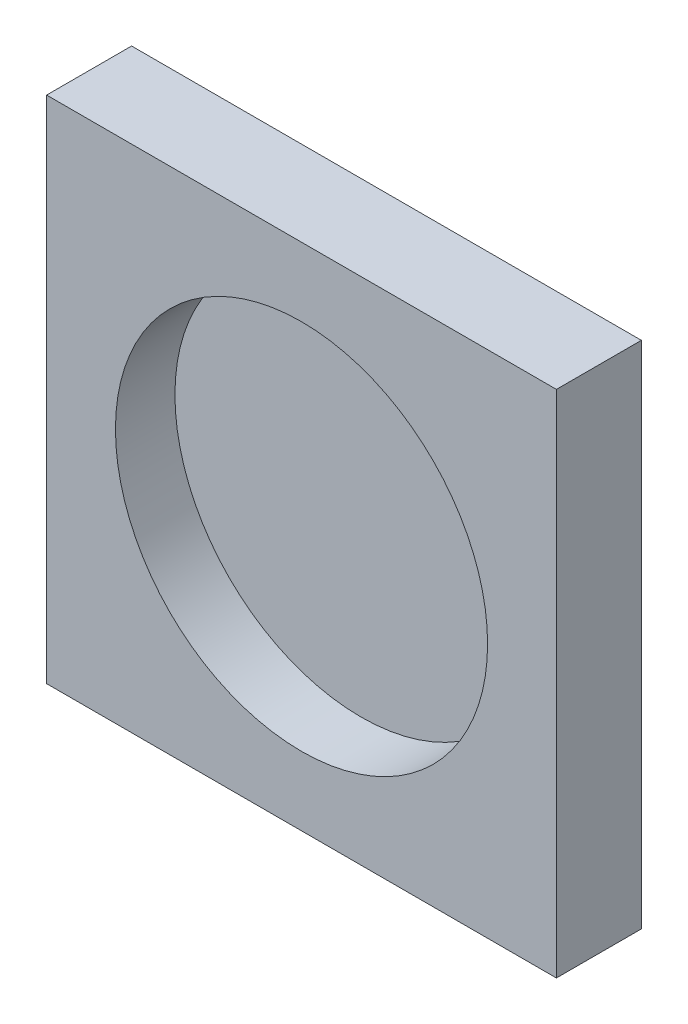
ISO-10303-21;
HEADER;
FILE_DESCRIPTION(('STEP AP214'),'2;1');
FILE_NAME('part.step','',(''),(''),'','','');
FILE_SCHEMA(('AUTOMOTIVE_DESIGN { 1 0 10303 214 1 1 1 1 }'));
ENDSEC;
DATA;
#1=APPLICATION_CONTEXT('core data for automotive mechanical design processes');
#2=APPLICATION_PROTOCOL_DEFINITION('international standard','automotive_design',2000,#1);
#3=PRODUCT_CONTEXT('',#1,'mechanical');
#4=PRODUCT('Part','Part','',(#3));
#5=PRODUCT_RELATED_PRODUCT_CATEGORY('part','',(#4));
#6=PRODUCT_DEFINITION_FORMATION('','',#4);
#7=PRODUCT_DEFINITION_CONTEXT('part definition',#1,'design');
#8=PRODUCT_DEFINITION('design','',#6,#7);
#9=PRODUCT_DEFINITION_SHAPE('','',#8);
#10=(LENGTH_UNIT() NAMED_UNIT(*) SI_UNIT(.MILLI.,.METRE.));
#11=(NAMED_UNIT(*) PLANE_ANGLE_UNIT() SI_UNIT($,.RADIAN.));
#12=(NAMED_UNIT(*) SI_UNIT($,.STERADIAN.) SOLID_ANGLE_UNIT());
#13=UNCERTAINTY_MEASURE_WITH_UNIT(LENGTH_MEASURE(1.E-05),#10,'distance_accuracy_value','');
#14=(GEOMETRIC_REPRESENTATION_CONTEXT(3) GLOBAL_UNCERTAINTY_ASSIGNED_CONTEXT((#13)) GLOBAL_UNIT_ASSIGNED_CONTEXT((#10,
#11,#12)) REPRESENTATION_CONTEXT('',''));
#15=CARTESIAN_POINT('',(0.,0.,0.));
#16=DIRECTION('',(0.,0.,1.));
#17=DIRECTION('',(1.,0.,0.));
#18=AXIS2_PLACEMENT_3D('',#15,#16,#17);
#19=CARTESIAN_POINT('',(30.,30.,10.));
#20=DIRECTION('',(-1.,0.,0.));
#21=DIRECTION('',(0.,-1.,0.));
#22=AXIS2_PLACEMENT_3D('',#19,#20,#21);
#23=PLANE('',#22);
#24=DIRECTION('',(0.,1.,0.));
#25=VECTOR('',#24,1.);
#26=CARTESIAN_POINT('',(30.,30.,0.));
#27=LINE('',#26,#25);
#28=CARTESIAN_POINT('',(30.,-30.,0.));
#29=VERTEX_POINT('',#28);
#30=CARTESIAN_POINT('',(30.,30.,0.));
#31=VERTEX_POINT('',#30);
#32=EDGE_CURVE('E111',#29,#31,#27,.T.);
#33=ORIENTED_EDGE('',*,*,#32,.T.);
#34=DIRECTION('',(0.,0.,-1.));
#35=VECTOR('',#34,1.);
#36=CARTESIAN_POINT('',(30.,30.,10.));
#37=LINE('',#36,#35);
#38=CARTESIAN_POINT('',(30.,30.,10.));
#39=VERTEX_POINT('',#38);
#40=EDGE_CURVE('E11',#39,#31,#37,.T.);
#41=ORIENTED_EDGE('',*,*,#40,.F.);
#42=DIRECTION('',(0.,1.,0.));
#43=VECTOR('',#42,1.);
#44=CARTESIAN_POINT('',(30.,30.,10.));
#45=LINE('',#44,#43);
#46=CARTESIAN_POINT('',(30.,-30.,10.));
#47=VERTEX_POINT('',#46);
#48=EDGE_CURVE('E95',#47,#39,#45,.T.);
#49=ORIENTED_EDGE('',*,*,#48,.F.);
#50=DIRECTION('',(0.,0.,-1.));
#51=VECTOR('',#50,1.);
#52=CARTESIAN_POINT('',(30.,-30.,10.));
#53=LINE('',#52,#51);
#54=EDGE_CURVE('E107',#47,#29,#53,.T.);
#55=ORIENTED_EDGE('',*,*,#54,.T.);
#56=EDGE_LOOP('',(#33,#41,#49,#55));
#57=FACE_BOUND('',#56,.T.);
#58=ADVANCED_FACE('F43',(#57),#23,.F.);
#59=CARTESIAN_POINT('',(-30.,30.,10.));
#60=DIRECTION('',(0.,-1.,0.));
#61=DIRECTION('',(0.,0.,-1.));
#62=AXIS2_PLACEMENT_3D('',#59,#60,#61);
#63=PLANE('',#62);
#64=DIRECTION('',(-1.,0.,0.));
#65=VECTOR('',#64,1.);
#66=CARTESIAN_POINT('',(-30.,30.,0.));
#67=LINE('',#66,#65);
#68=CARTESIAN_POINT('',(-30.,30.,0.));
#69=VERTEX_POINT('',#68);
#70=EDGE_CURVE('E100',#31,#69,#67,.T.);
#71=ORIENTED_EDGE('',*,*,#70,.T.);
#72=DIRECTION('',(0.,0.,-1.));
#73=VECTOR('',#72,1.);
#74=CARTESIAN_POINT('',(-30.,30.,10.));
#75=LINE('',#74,#73);
#76=CARTESIAN_POINT('',(-30.,30.,10.));
#77=VERTEX_POINT('',#76);
#78=EDGE_CURVE('E52',#77,#69,#75,.T.);
#79=ORIENTED_EDGE('',*,*,#78,.F.);
#80=DIRECTION('',(-1.,0.,0.));
#81=VECTOR('',#80,1.);
#82=CARTESIAN_POINT('',(-30.,30.,10.));
#83=LINE('',#82,#81);
#84=EDGE_CURVE('E90',#39,#77,#83,.T.);
#85=ORIENTED_EDGE('',*,*,#84,.F.);
#86=ORIENTED_EDGE('',*,*,#40,.T.);
#87=EDGE_LOOP('',(#71,#79,#85,#86));
#88=FACE_BOUND('',#87,.T.);
#89=ADVANCED_FACE('F99',(#88),#63,.F.);
#90=CARTESIAN_POINT('',(-30.,30.,10.));
#91=DIRECTION('',(1.,0.,0.));
#92=DIRECTION('',(0.,1.,0.));
#93=AXIS2_PLACEMENT_3D('',#90,#91,#92);
#94=PLANE('',#93);
#95=DIRECTION('',(0.,-1.,0.));
#96=VECTOR('',#95,1.);
#97=CARTESIAN_POINT('',(-30.,30.,0.));
#98=LINE('',#97,#96);
#99=CARTESIAN_POINT('',(-30.,-30.,0.));
#100=VERTEX_POINT('',#99);
#101=EDGE_CURVE('E77',#69,#100,#98,.T.);
#102=ORIENTED_EDGE('',*,*,#101,.T.);
#103=DIRECTION('',(0.,0.,-1.));
#104=VECTOR('',#103,1.);
#105=CARTESIAN_POINT('',(-30.,-30.,10.));
#106=LINE('',#105,#104);
#107=CARTESIAN_POINT('',(-30.,-30.,10.));
#108=VERTEX_POINT('',#107);
#109=EDGE_CURVE('E102',#108,#100,#106,.T.);
#110=ORIENTED_EDGE('',*,*,#109,.F.);
#111=DIRECTION('',(0.,-1.,0.));
#112=VECTOR('',#111,1.);
#113=CARTESIAN_POINT('',(-30.,30.,10.));
#114=LINE('',#113,#112);
#115=EDGE_CURVE('E93',#77,#108,#114,.T.);
#116=ORIENTED_EDGE('',*,*,#115,.F.);
#117=ORIENTED_EDGE('',*,*,#78,.T.);
#118=EDGE_LOOP('',(#102,#110,#116,#117));
#119=FACE_BOUND('',#118,.T.);
#120=ADVANCED_FACE('F103',(#119),#94,.F.);
#121=CARTESIAN_POINT('',(-30.,-30.,10.));
#122=DIRECTION('',(0.,1.,0.));
#123=DIRECTION('',(0.,0.,1.));
#124=AXIS2_PLACEMENT_3D('',#121,#122,#123);
#125=PLANE('',#124);
#126=DIRECTION('',(1.,0.,0.));
#127=VECTOR('',#126,1.);
#128=CARTESIAN_POINT('',(-30.,-30.,0.));
#129=LINE('',#128,#127);
#130=EDGE_CURVE('E83',#100,#29,#129,.T.);
#131=ORIENTED_EDGE('',*,*,#130,.T.);
#132=ORIENTED_EDGE('',*,*,#54,.F.);
#133=DIRECTION('',(1.,0.,0.));
#134=VECTOR('',#133,1.);
#135=CARTESIAN_POINT('',(-30.,-30.,10.));
#136=LINE('',#135,#134);
#137=EDGE_CURVE('E60',#108,#47,#136,.T.);
#138=ORIENTED_EDGE('',*,*,#137,.F.);
#139=ORIENTED_EDGE('',*,*,#109,.T.);
#140=EDGE_LOOP('',(#131,#132,#138,#139));
#141=FACE_BOUND('',#140,.T.);
#142=ADVANCED_FACE('F125',(#141),#125,.F.);
#143=CARTESIAN_POINT('',(0.,0.,10.));
#144=DIRECTION('',(0.,0.,1.));
#145=DIRECTION('',(1.,0.,0.));
#146=AXIS2_PLACEMENT_3D('',#143,#144,#145);
#147=PLANE('',#146);
#148=CARTESIAN_POINT('',(0.,0.,10.));
#149=DIRECTION('',(0.,0.,1.));
#150=DIRECTION('',(1.,0.,0.));
#151=AXIS2_PLACEMENT_3D('',#148,#149,#150);
#152=CIRCLE('',#151,21.9);
#153=CARTESIAN_POINT('',(21.9,0.,10.));
#154=VERTEX_POINT('',#153);
#155=EDGE_CURVE('E132',#154,#154,#152,.T.);
#156=ORIENTED_EDGE('',*,*,#155,.F.);
#157=EDGE_LOOP('',(#156));
#158=FACE_BOUND('',#157,.T.);
#159=ORIENTED_EDGE('',*,*,#48,.T.);
#160=ORIENTED_EDGE('',*,*,#84,.T.);
#161=ORIENTED_EDGE('',*,*,#115,.T.);
#162=ORIENTED_EDGE('',*,*,#137,.T.);
#163=EDGE_LOOP('',(#159,#160,#161,#162));
#164=FACE_BOUND('',#163,.T.);
#165=ADVANCED_FACE('F91',(#158,#164),#147,.T.);
#166=CARTESIAN_POINT('',(0.,0.,0.));
#167=DIRECTION('',(0.,0.,1.));
#168=DIRECTION('',(1.,0.,0.));
#169=AXIS2_PLACEMENT_3D('',#166,#167,#168);
#170=PLANE('',#169);
#171=ORIENTED_EDGE('',*,*,#32,.F.);
#172=ORIENTED_EDGE('',*,*,#130,.F.);
#173=ORIENTED_EDGE('',*,*,#101,.F.);
#174=ORIENTED_EDGE('',*,*,#70,.F.);
#175=EDGE_LOOP('',(#171,#172,#173,#174));
#176=FACE_BOUND('',#175,.T.);
#177=ADVANCED_FACE('F128',(#176),#170,.F.);
#178=CARTESIAN_POINT('',(0.,0.,3.));
#179=DIRECTION('',(0.,0.,1.));
#180=DIRECTION('',(1.,0.,0.));
#181=AXIS2_PLACEMENT_3D('',#178,#179,#180);
#182=CYLINDRICAL_SURFACE('',#181,21.9);
#183=CARTESIAN_POINT('',(0.,0.,3.));
#184=DIRECTION('',(0.,0.,1.));
#185=DIRECTION('',(1.,0.,0.));
#186=AXIS2_PLACEMENT_3D('',#183,#184,#185);
#187=CIRCLE('',#186,21.9);
#188=CARTESIAN_POINT('',(21.9,0.,3.));
#189=VERTEX_POINT('',#188);
#190=EDGE_CURVE('E115',#189,#189,#187,.T.);
#191=ORIENTED_EDGE('',*,*,#190,.F.);
#192=EDGE_LOOP('',(#191));
#193=FACE_BOUND('',#192,.T.);
#194=ORIENTED_EDGE('',*,*,#155,.T.);
#195=EDGE_LOOP('',(#194));
#196=FACE_BOUND('',#195,.T.);
#197=ADVANCED_FACE('F142',(#193,#196),#182,.F.);
#198=CARTESIAN_POINT('',(0.,0.,3.));
#199=DIRECTION('',(0.,0.,1.));
#200=DIRECTION('',(1.,0.,0.));
#201=AXIS2_PLACEMENT_3D('',#198,#199,#200);
#202=PLANE('',#201);
#203=ORIENTED_EDGE('',*,*,#190,.T.);
#204=EDGE_LOOP('',(#203));
#205=FACE_BOUND('',#204,.T.);
#206=ADVANCED_FACE('F140',(#205),#202,.T.);
#207=CLOSED_SHELL('',(#58,#89,#120,#142,#165,#177,#197,#206));
#208=MANIFOLD_SOLID_BREP('B2',#207);
#209=ADVANCED_BREP_SHAPE_REPRESENTATION('',(#18,#208),#14);
#210=SHAPE_DEFINITION_REPRESENTATION(#9,#209);
ENDSEC;
END-ISO-10303-21;
